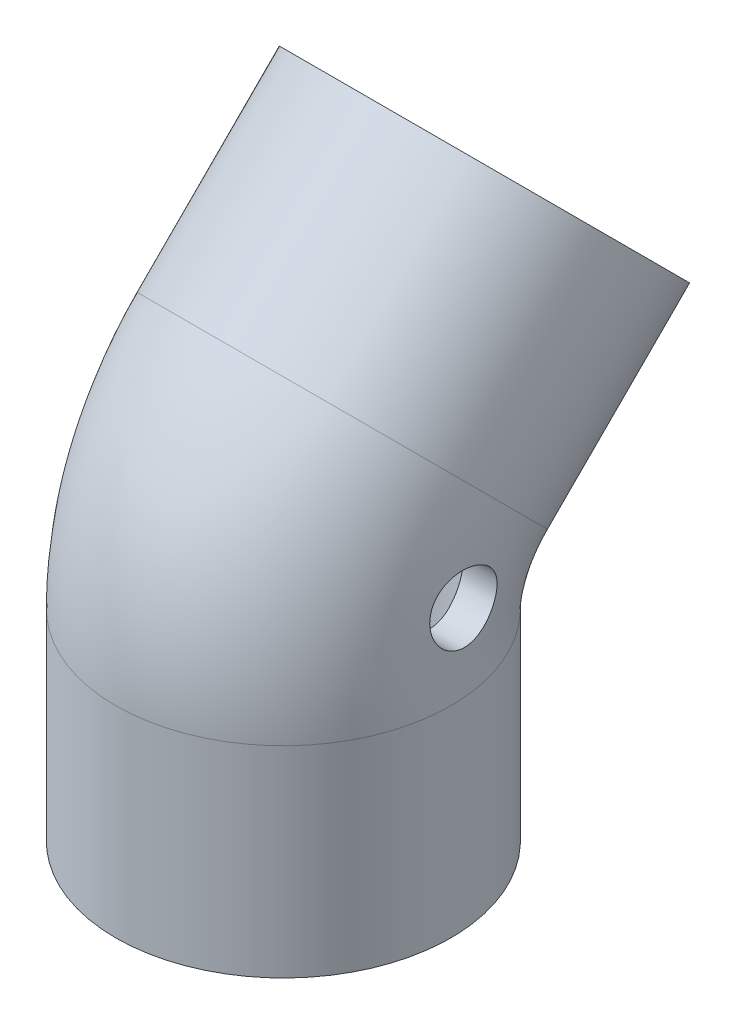
ISO-10303-21;
HEADER;
FILE_DESCRIPTION(('STEP AP214'),'2;1');
FILE_NAME('part.step','',(''),(''),'','','');
FILE_SCHEMA(('AUTOMOTIVE_DESIGN { 1 0 10303 214 1 1 1 1 }'));
ENDSEC;
DATA;
#1=APPLICATION_CONTEXT('core data for automotive mechanical design processes');
#2=APPLICATION_PROTOCOL_DEFINITION('international standard','automotive_design',2000,#1);
#3=PRODUCT_CONTEXT('',#1,'mechanical');
#4=PRODUCT('Part','Part','',(#3));
#5=PRODUCT_RELATED_PRODUCT_CATEGORY('part','',(#4));
#6=PRODUCT_DEFINITION_FORMATION('','',#4);
#7=PRODUCT_DEFINITION_CONTEXT('part definition',#1,'design');
#8=PRODUCT_DEFINITION('design','',#6,#7);
#9=PRODUCT_DEFINITION_SHAPE('','',#8);
#10=(LENGTH_UNIT() NAMED_UNIT(*) SI_UNIT(.MILLI.,.METRE.));
#11=(NAMED_UNIT(*) PLANE_ANGLE_UNIT() SI_UNIT($,.RADIAN.));
#12=(NAMED_UNIT(*) SI_UNIT($,.STERADIAN.) SOLID_ANGLE_UNIT());
#13=UNCERTAINTY_MEASURE_WITH_UNIT(LENGTH_MEASURE(1.E-05),#10,'distance_accuracy_value','');
#14=(GEOMETRIC_REPRESENTATION_CONTEXT(3) GLOBAL_UNCERTAINTY_ASSIGNED_CONTEXT((#13)) GLOBAL_UNIT_ASSIGNED_CONTEXT((#10,
#11,#12)) REPRESENTATION_CONTEXT('',''));
#15=CARTESIAN_POINT('',(0.,0.,0.));
#16=DIRECTION('',(0.,0.,1.));
#17=DIRECTION('',(1.,0.,0.));
#18=AXIS2_PLACEMENT_3D('',#15,#16,#17);
#19=CARTESIAN_POINT('',(0.,15.,-15.));
#20=DIRECTION('',(-1.,0.,0.));
#21=DIRECTION('',(0.,0.,1.));
#22=AXIS2_PLACEMENT_3D('',#19,#20,#21);
#23=TOROIDAL_SURFACE('',#22,15.,12.5);
#24=CARTESIAN_POINT('',(12.288883588417,18.9948372391797,-2.93164753841922));
#25=CARTESIAN_POINT('',(12.3003874428069,18.8937970530453,-2.83310858764716));
#26=CARTESIAN_POINT('',(12.3137714026915,18.8011760237777,-2.72605085239143));
#27=CARTESIAN_POINT('',(12.3423878016527,18.6353105691316,-2.49795967632841));
#28=CARTESIAN_POINT('',(12.357622186022,18.5620867971623,-2.37691153444068));
#29=CARTESIAN_POINT('',(12.3878932182851,18.4370715600438,-2.12425755544));
#30=CARTESIAN_POINT('',(12.4029299667146,18.3852687546265,-1.99265734876563));
#31=CARTESIAN_POINT('',(12.4309589320613,18.3045305064457,-1.72244470115781));
#32=CARTESIAN_POINT('',(12.4439517398107,18.2755884456713,-1.58383430199431));
#33=CARTESIAN_POINT('',(12.4664068014922,18.2415112232606,-1.30362383571792));
#34=CARTESIAN_POINT('',(12.4758740523374,18.2363422481425,-1.16202830284697));
#35=CARTESIAN_POINT('',(12.4903429453535,18.2500117535003,-0.879767456934533));
#36=CARTESIAN_POINT('',(12.4953449442561,18.2688483158676,-0.739102070474471));
#37=CARTESIAN_POINT('',(12.5004533046702,18.3294572130655,-0.465551626485015));
#38=CARTESIAN_POINT('',(12.5006517544592,18.3707825591869,-0.332569073933029));
#39=CARTESIAN_POINT('',(12.4965569986737,18.474874034788,-0.075358659830736));
#40=CARTESIAN_POINT('',(12.4922639032033,18.5376396386636,0.0488694162439837));
#41=CARTESIAN_POINT('',(12.4798336206555,18.6824287292132,0.284518159407894));
#42=CARTESIAN_POINT('',(12.4717143512883,18.7643615657344,0.395995544374081));
#43=CARTESIAN_POINT('',(12.4525790026319,18.9453091017457,0.603806904643763));
#44=CARTESIAN_POINT('',(12.4415627078259,19.0443250719038,0.700139752455366));
#45=CARTESIAN_POINT('',(12.4176153750525,19.258203057357,0.876360157819983));
#46=CARTESIAN_POINT('',(12.4046597216919,19.3732672511891,0.955998979157651));
#47=CARTESIAN_POINT('',(12.3782494341171,19.6150095151522,1.09499292354472));
#48=CARTESIAN_POINT('',(12.3647947598023,19.74168851984,1.15434641256573));
#49=CARTESIAN_POINT('',(12.3385277777851,20.0048008643738,1.25173033832018));
#50=CARTESIAN_POINT('',(12.3257250280151,20.1413324009613,1.28949842604306));
#51=CARTESIAN_POINT('',(12.3021788808415,20.4189841159326,1.34148385925607));
#52=CARTESIAN_POINT('',(12.2914354306454,20.560104176576,1.35570180855137));
#53=CARTESIAN_POINT('',(12.273089930619,20.8422739303841,1.36007382402743));
#54=CARTESIAN_POINT('',(12.2654736154289,20.9833209440594,1.35033861557051));
#55=CARTESIAN_POINT('',(12.2540480333639,21.2619090566992,1.30722055756653));
#56=CARTESIAN_POINT('',(12.2502384207945,21.3994504729087,1.27383985578585));
#57=CARTESIAN_POINT('',(12.246818698117,21.6651912298252,1.18496195942299));
#58=CARTESIAN_POINT('',(12.2471529995867,21.7934910562248,1.12976711487198));
#59=CARTESIAN_POINT('',(12.2518542011023,22.0390680137187,0.998855493655339));
#60=CARTESIAN_POINT('',(12.256220984926,22.1563454623873,0.923139308490056));
#61=CARTESIAN_POINT('',(12.2685488438142,22.3761347375974,0.753730889226753));
#62=CARTESIAN_POINT('',(12.2764956458914,22.4787030867614,0.660110879782226));
#63=CARTESIAN_POINT('',(12.295238749662,22.6668467150864,0.457367821099208));
#64=CARTESIAN_POINT('',(12.3060352266668,22.7524209482045,0.348243818248384));
#65=CARTESIAN_POINT('',(12.3296028174033,22.9051255993151,0.11628864322844));
#66=CARTESIAN_POINT('',(12.3423936749366,22.9720505989556,-0.00667573177779422));
#67=CARTESIAN_POINT('',(12.3686527952611,23.0844693808191,-0.261977167830172));
#68=CARTESIAN_POINT('',(12.382121112902,23.1299614246474,-0.394314988141228));
#69=CARTESIAN_POINT('',(12.4085813179926,23.1986662394157,-0.66631522916604));
#70=CARTESIAN_POINT('',(12.4215660995535,23.2216213723198,-0.806043533289644));
#71=CARTESIAN_POINT('',(12.4455554641779,23.2436463203071,-1.08754399278206));
#72=CARTESIAN_POINT('',(12.4565600787453,23.2427165154268,-1.22931611559552));
#73=CARTESIAN_POINT('',(12.47533302631,23.2169454694891,-1.51034157798607));
#74=CARTESIAN_POINT('',(12.4831137342956,23.192196896462,-1.64960254888811));
#75=CARTESIAN_POINT('',(12.4945385936525,23.1195356699708,-1.92211884591513));
#76=CARTESIAN_POINT('',(12.4981832382143,23.0716257792683,-2.05537488625687));
#77=CARTESIAN_POINT('',(12.5007378993866,22.9549399218379,-2.30990159818192));
#78=CARTESIAN_POINT('',(12.499722060136,22.8865067955249,-2.4313287876631));
#79=CARTESIAN_POINT('',(12.4930445528985,22.7305184208721,-2.66105431135712));
#80=CARTESIAN_POINT('',(12.4873831138783,22.6429641151097,-2.76935329231515));
#81=CARTESIAN_POINT('',(12.4719152962346,22.4519040325848,-2.96916522583562));
#82=CARTESIAN_POINT('',(12.4621347877511,22.3485003341608,-3.06077791980664));
#83=CARTESIAN_POINT('',(12.4393952599865,22.1282705377154,-3.22563246078265));
#84=CARTESIAN_POINT('',(12.426435903191,22.0114430151195,-3.29887235538371));
#85=CARTESIAN_POINT('',(12.3985402022792,21.7656852945775,-3.42608339903032));
#86=CARTESIAN_POINT('',(12.3835769932665,21.6365991611941,-3.47974733414348));
#87=CARTESIAN_POINT('',(12.3536414810486,21.3712909853386,-3.56486326860571));
#88=CARTESIAN_POINT('',(12.3386691770662,21.2350682101623,-3.59631298244746));
#89=CARTESIAN_POINT('',(12.3104783666979,20.9571244370841,-3.63639202664159));
#90=CARTESIAN_POINT('',(12.2972876022002,20.8153529687929,-3.64469293728533));
#91=CARTESIAN_POINT('',(12.2748348621588,20.5321178243436,-3.6371510180576));
#92=CARTESIAN_POINT('',(12.2655728318641,20.3906541439234,-3.62130852466333));
#93=CARTESIAN_POINT('',(12.2525250559725,20.1144503125081,-3.56624297185889));
#94=CARTESIAN_POINT('',(12.2486540936415,19.9796388136348,-3.52739790619639));
#95=CARTESIAN_POINT('',(12.2467300984423,19.7184520735696,-3.42772628286173));
#96=CARTESIAN_POINT('',(12.2486716797378,19.5920691335314,-3.36692012001189));
#97=CARTESIAN_POINT('',(12.2567171054166,19.3852313598203,-3.24514528968024));
#98=CARTESIAN_POINT('',(12.261501020281,19.3018358727252,-3.18900416877197));
#99=CARTESIAN_POINT('',(12.2735021440345,19.1424924425122,-3.06722152329225));
#100=CARTESIAN_POINT('',(12.2807193969112,19.0665446340589,-3.00157982698998));
#101=CARTESIAN_POINT('',(12.288883588417,18.9948372391797,-2.93164753841922));
#102=B_SPLINE_CURVE_WITH_KNOTS('',3,(#24,#25,#26,#27,#28,#29,#30,#31,#32,#33,#34,#35,#36,#37,
#38,#39,#40,#41,#42,#43,#44,#45,#46,#47,#48,#49,#50,#51,#52,#53,#54,#55,#56,#57,#58,#59,#60,#61,
#62,#63,#64,#65,#66,#67,#68,#69,#70,#71,#72,#73,#74,#75,#76,#77,#78,#79,#80,#81,#82,#83,#84,#85,
#86,#87,#88,#89,#90,#91,#92,#93,#94,#95,#96,#97,#98,#99,#100,#101),.UNSPECIFIED.,.T.,.F.,(4,2,2,
2,2,2,2,2,2,2,2,2,2,2,2,2,2,2,2,2,2,2,2,2,2,2,2,2,2,2,2,2,2,2,2,2,2,2,4),(0.,0.424438661985997,
0.849327448837742,1.27399101052955,1.69853159026181,2.12246814055013,2.5463708192616,
2.96214033649529,3.37789966194325,3.79173107412529,4.20559328096438,4.62524136205356,
5.04492323876115,5.4696030149229,5.89427190249438,6.31698141587934,6.73965253865544,
7.15665995675889,7.57365535645638,7.98900277350331,8.40437574861245,8.8241578033298,
9.24397390007543,9.66853524031383,10.0930898253029,10.5159993100233,10.9388583610878,
11.3550136403662,11.7711484099229,12.1847076962593,12.5983109112889,13.0181509937492,
13.4380342651136,13.8638449710833,14.2896497427499,14.7086443294834,15.1272508008479,
15.4284660073661,15.7296866592812),.UNSPECIFIED.);
#103=CARTESIAN_POINT('',(12.288883588417,18.9948372391797,-2.93164753841922));
#104=VERTEX_POINT('',#103);
#105=EDGE_CURVE('E123',#104,#104,#102,.T.);
#106=ORIENTED_EDGE('',*,*,#105,.T.);
#107=EDGE_LOOP('',(#106));
#108=FACE_BOUND('',#107,.T.);
#109=CARTESIAN_POINT('',(0.,25.6066017177982,-4.39339828220179));
#110=DIRECTION('',(0.,0.707106781186547,-0.707106781186548));
#111=DIRECTION('',(0.,0.707106781186548,0.707106781186547));
#112=AXIS2_PLACEMENT_3D('',#109,#110,#111);
#113=CIRCLE('',#112,12.5);
#114=CARTESIAN_POINT('',(0.,34.4454364826301,4.44543648263005));
#115=VERTEX_POINT('',#114);
#116=EDGE_CURVE('E97',#115,#115,#113,.T.);
#117=ORIENTED_EDGE('',*,*,#116,.F.);
#118=EDGE_LOOP('',(#117));
#119=FACE_BOUND('',#118,.T.);
#120=CARTESIAN_POINT('',(0.,14.9999999999999,0.));
#121=DIRECTION('',(0.,1.,0.));
#122=DIRECTION('',(0.,0.,1.));
#123=AXIS2_PLACEMENT_3D('',#120,#121,#122);
#124=CIRCLE('',#123,12.5);
#125=CARTESIAN_POINT('',(0.,14.9999999999999,12.5));
#126=VERTEX_POINT('',#125);
#127=EDGE_CURVE('E98',#126,#126,#124,.T.);
#128=ORIENTED_EDGE('',*,*,#127,.T.);
#129=EDGE_LOOP('',(#128));
#130=FACE_BOUND('',#129,.T.);
#131=CARTESIAN_POINT('',(-12.288883588417,18.9948372391797,-2.93164753841922));
#132=CARTESIAN_POINT('',(-12.2777229133281,19.0929048318468,-3.02727532144304));
#133=CARTESIAN_POINT('',(-12.2683245620019,19.1989891796134,-3.11496517813435));
#134=CARTESIAN_POINT('',(-12.2544288517944,19.4243645811981,-3.27190345704765));
#135=CARTESIAN_POINT('',(-12.2499335244553,19.5436610868698,-3.3411442260148));
#136=CARTESIAN_POINT('',(-12.2465315839008,19.7921139630912,-3.45912145042502));
#137=CARTESIAN_POINT('',(-12.247626252528,19.9212725884354,-3.50785320016975));
#138=CARTESIAN_POINT('',(-12.2552393234137,20.18567816484,-3.58339582572215));
#139=CARTESIAN_POINT('',(-12.2617574978479,20.3209248599341,-3.61020762222448));
#140=CARTESIAN_POINT('',(-12.2792040204306,20.5931571728481,-3.64121955999185));
#141=CARTESIAN_POINT('',(-12.2901153103469,20.7301341020603,-3.64550627054378));
#142=CARTESIAN_POINT('',(-12.3148131454244,21.0027021327031,-3.63173648744673));
#143=CARTESIAN_POINT('',(-12.3286001826137,21.1382929928133,-3.61367616770501));
#144=CARTESIAN_POINT('',(-12.3575998503518,21.4079232530355,-3.55504445630215));
#145=CARTESIAN_POINT('',(-12.3728393226367,21.5418411552377,-3.51392687039393));
#146=CARTESIAN_POINT('',(-12.4025037756119,21.8010322213587,-3.40990013131575));
#147=CARTESIAN_POINT('',(-12.4169287146196,21.9263049429441,-3.34698986410642));
#148=CARTESIAN_POINT('',(-12.4434120450699,22.166143647358,-3.20016053969492));
#149=CARTESIAN_POINT('',(-12.4554418524808,22.2805726473426,-3.11601211527775));
#150=CARTESIAN_POINT('',(-12.4755937622908,22.4937328453322,-2.92936545182744));
#151=CARTESIAN_POINT('',(-12.483716311999,22.592465839374,-2.82686931511387));
#152=CARTESIAN_POINT('',(-12.4951754747925,22.7697436020721,-2.60830947409199));
#153=CARTESIAN_POINT('',(-12.4985897670818,22.8485980508785,-2.49250100617509));
#154=CARTESIAN_POINT('',(-12.5006971719116,22.9858919716538,-2.24932308985991));
#155=CARTESIAN_POINT('',(-12.499390583824,23.0443327378867,-2.12195437504722));
#156=CARTESIAN_POINT('',(-12.4924305028138,23.1385545856441,-1.86094894366677));
#157=CARTESIAN_POINT('',(-12.4868293009963,23.1745988770711,-1.72740565665933));
#158=CARTESIAN_POINT('',(-12.4720713354235,23.2242018639557,-1.45640115021195));
#159=CARTESIAN_POINT('',(-12.4629143942524,23.2377594372465,-1.31893973559173));
#160=CARTESIAN_POINT('',(-12.4419633296713,23.2421370399908,-1.04256047708997));
#161=CARTESIAN_POINT('',(-12.430145206638,23.2327419593284,-0.903641097665344));
#162=CARTESIAN_POINT('',(-12.4051431527752,23.1911029753242,-0.629392997457251));
#163=CARTESIAN_POINT('',(-12.3919590952452,23.1588569507641,-0.494064611230219));
#164=CARTESIAN_POINT('',(-12.3653124908107,23.0717523945763,-0.228622205857845));
#165=CARTESIAN_POINT('',(-12.3518487462248,23.0165595116882,-0.0986178894345666));
#166=CARTESIAN_POINT('',(-12.3261524125063,22.8850411291628,0.150361523297204));
#167=CARTESIAN_POINT('',(-12.3139198427002,22.8087152978606,0.269336446468873));
#168=CARTESIAN_POINT('',(-12.2918499355255,22.6368868914225,0.493028552716742));
#169=CARTESIAN_POINT('',(-12.2820156017211,22.5413605396738,0.597727785258275));
#170=CARTESIAN_POINT('',(-12.2657146684937,22.3338523838324,0.789617783799687));
#171=CARTESIAN_POINT('',(-12.2592477873851,22.2218719571186,0.876810013875114));
#172=CARTESIAN_POINT('',(-12.2503668060673,21.9861549478341,1.03011486167025));
#173=CARTESIAN_POINT('',(-12.2479032111219,21.8625822361423,1.09647659987288));
#174=CARTESIAN_POINT('',(-12.2471095136474,21.6060829326363,1.20763332917245));
#175=CARTESIAN_POINT('',(-12.2487791646069,21.4731568991242,1.25242960626736));
#176=CARTESIAN_POINT('',(-12.2560589788867,21.2029942112081,1.31889478040749));
#177=CARTESIAN_POINT('',(-12.2616344773958,21.0658055480378,1.34076293591191));
#178=CARTESIAN_POINT('',(-12.2761661332374,20.7898813202942,1.36152687356843));
#179=CARTESIAN_POINT('',(-12.2851224098481,20.6511457013099,1.36042184512163));
#180=CARTESIAN_POINT('',(-12.3056505356214,20.3750594433677,1.33528278825487));
#181=CARTESIAN_POINT('',(-12.3172389455758,20.2377235893151,1.31110033669762));
#182=CARTESIAN_POINT('',(-12.3419135107961,19.9690875232846,1.24033569532217));
#183=CARTESIAN_POINT('',(-12.3549997951,19.8377878326752,1.19375157454651));
#184=CARTESIAN_POINT('',(-12.3816106844272,19.5830672535571,1.07871318965757));
#185=CARTESIAN_POINT('',(-12.395138800033,19.4597738469347,1.00997725833835));
#186=CARTESIAN_POINT('',(-12.4211195979993,19.2264044562651,0.852702200488146));
#187=CARTESIAN_POINT('',(-12.433572249276,19.1163288542129,0.764162501839278));
#188=CARTESIAN_POINT('',(-12.4561225707412,18.9122854817826,0.569468963286026));
#189=CARTESIAN_POINT('',(-12.4662151103071,18.8183529198839,0.463277591771645));
#190=CARTESIAN_POINT('',(-12.4828563697692,18.6496586647348,0.236380559473037));
#191=CARTESIAN_POINT('',(-12.4894054336267,18.5748951111401,0.115676308829247));
#192=CARTESIAN_POINT('',(-12.4980419982529,18.4476772334035,-0.13503366429367));
#193=CARTESIAN_POINT('',(-12.5001893173785,18.3949316641494,-0.264889524965462));
#194=CARTESIAN_POINT('',(-12.4997844421931,18.3118557700591,-0.531566143936225));
#195=CARTESIAN_POINT('',(-12.4972327868318,18.2815228751559,-0.668386101736616));
#196=CARTESIAN_POINT('',(-12.4875796544457,18.2443306317252,-0.943326578650891));
#197=CARTESIAN_POINT('',(-12.4805334098919,18.2371926508062,-1.08141152288568));
#198=CARTESIAN_POINT('',(-12.4625573305176,18.2456959893596,-1.35664019761236));
#199=CARTESIAN_POINT('',(-12.4516267374628,18.2613417581234,-1.49378373900867));
#200=CARTESIAN_POINT('',(-12.426890688946,18.3150951286541,-1.76458022050273));
#201=CARTESIAN_POINT('',(-12.4130607012967,18.3533998435464,-1.89819164698624));
#202=CARTESIAN_POINT('',(-12.3841620943039,18.4515002440857,-2.15707067550408));
#203=CARTESIAN_POINT('',(-12.369094135327,18.5112845286371,-2.28234266228015));
#204=CARTESIAN_POINT('',(-12.3423475115794,18.6375927614562,-2.49880804498899));
#205=CARTESIAN_POINT('',(-12.3305643086408,18.7007355180596,-2.59198010392068));
#206=CARTESIAN_POINT('',(-12.3084185178594,18.8390598888312,-2.76910429339723));
#207=CARTESIAN_POINT('',(-12.2980558955824,18.9142412110934,-2.85305664741432));
#208=CARTESIAN_POINT('',(-12.288883588417,18.9948372391797,-2.93164753841922));
#209=B_SPLINE_CURVE_WITH_KNOTS('',3,(#131,#132,#133,#134,#135,#136,#137,#138,#139,#140,#141,
#142,#143,#144,#145,#146,#147,#148,#149,#150,#151,#152,#153,#154,#155,#156,#157,#158,#159,#160,
#161,#162,#163,#164,#165,#166,#167,#168,#169,#170,#171,#172,#173,#174,#175,#176,#177,#178,#179,
#180,#181,#182,#183,#184,#185,#186,#187,#188,#189,#190,#191,#192,#193,#194,#195,#196,#197,#198,
#199,#200,#201,#202,#203,#204,#205,#206,#207,#208),.UNSPECIFIED.,.T.,.F.,(4,2,2,2,2,2,2,2,2,2,2,
2,2,2,2,2,2,2,2,2,2,2,2,2,2,2,2,2,2,2,2,2,2,2,2,2,2,2,4),(0.,0.411889468897534,
0.823949537262058,1.2361040994008,1.64824134909357,2.05879349219067,2.46941593670731,
2.89020334376481,3.31101226460138,3.73657634558113,4.16209169570692,4.58049911472572,
4.99888000115009,5.41224604108632,5.82563270883216,6.24290843414383,6.66022289959981,
7.08384372791817,7.50747120501111,7.93162654173425,8.35574639240875,8.77458159206005,
9.19339181251183,9.60853137775612,10.0236855910463,10.4415280038063,10.8594064398006,
11.2828231062876,11.7062520065854,12.1305930107901,12.5548928172716,12.973387233251,
13.3918336529212,13.8052344708416,14.2187160299645,14.6358485385016,15.0527599644578,
15.3912760749963,15.7297839785847),.UNSPECIFIED.);
#210=CARTESIAN_POINT('',(-12.288883588417,18.9948372391797,-2.93164753841922));
#211=VERTEX_POINT('',#210);
#212=EDGE_CURVE('E102',#211,#211,#209,.T.);
#213=ORIENTED_EDGE('',*,*,#212,.T.);
#214=EDGE_LOOP('',(#213));
#215=FACE_BOUND('',#214,.T.);
#216=ADVANCED_FACE('F38',(#108,#119,#130,#215),#23,.T.);
#217=CARTESIAN_POINT('',(0.,15.,-15.));
#218=DIRECTION('',(-1.,0.,0.));
#219=DIRECTION('',(0.,0.,1.));
#220=AXIS2_PLACEMENT_3D('',#217,#218,#219);
#221=TOROIDAL_SURFACE('',#220,15.,10.);
#222=CARTESIAN_POINT('',(9.72499693254238,19.0673285651124,-2.99958226852333));
#223=CARTESIAN_POINT('',(9.71223497127756,19.1675473944109,-3.08982583141909));
#224=CARTESIAN_POINT('',(9.70184360116631,19.2752726417541,-3.17211283319867));
#225=CARTESIAN_POINT('',(9.68733489044142,19.5029239722273,-3.31834565650668));
#226=CARTESIAN_POINT('',(9.68321755294937,19.6228500614276,-3.38229146890956));
#227=CARTESIAN_POINT('',(9.68189216876927,19.8715581563725,-3.4899419159074));
#228=CARTESIAN_POINT('',(9.68468660235557,20.0003433250573,-3.53363927770821));
#229=CARTESIAN_POINT('',(9.69675629380745,20.2629985792929,-3.59956431097562));
#230=CARTESIAN_POINT('',(9.70603228416443,20.3968692379461,-3.62178955516636));
#231=CARTESIAN_POINT('',(9.72966602218806,20.6657659445238,-3.64433252613683));
#232=CARTESIAN_POINT('',(9.74401613425973,20.8007899605659,-3.64468303036617));
#233=CARTESIAN_POINT('',(9.77583169121665,21.0687840647574,-3.62377038176643));
#234=CARTESIAN_POINT('',(9.79329784971941,21.2017536748238,-3.60250227272523));
#235=CARTESIAN_POINT('',(9.82987710239602,21.4677403031769,-3.53768766042283));
#236=CARTESIAN_POINT('',(9.84902824212689,21.6005414362387,-3.49327433895385));
#237=CARTESIAN_POINT('',(9.88593733070498,21.8570572628791,-3.38284363039));
#238=CARTESIAN_POINT('',(9.90369519328115,21.9807713937647,-3.3168249068059));
#239=CARTESIAN_POINT('',(9.9359786999212,22.2173261101896,-3.16377413115249));
#240=CARTESIAN_POINT('',(9.95045827278084,22.3300004174051,-3.07647458395149));
#241=CARTESIAN_POINT('',(9.97429148835595,22.5391635576219,-2.88368355212896));
#242=CARTESIAN_POINT('',(9.98364610878614,22.6356554753857,-2.77819554247017));
#243=CARTESIAN_POINT('',(9.99617666468471,22.8070160632866,-2.55521117106723));
#244=CARTESIAN_POINT('',(9.99951528165419,22.8824059458106,-2.43812431791256));
#245=CARTESIAN_POINT('',(10.000385918998,23.0127233544668,-2.19305746359418));
#246=CARTESIAN_POINT('',(9.99791840917035,23.0676525357437,-2.06507834457706));
#247=CARTESIAN_POINT('',(9.98775415957109,23.1547865224743,-1.80411030973334));
#248=CARTESIAN_POINT('',(9.98014197308299,23.1873418588805,-1.67123474914512));
#249=CARTESIAN_POINT('',(9.96071658035609,23.2303756128953,-1.40226089545764));
#250=CARTESIAN_POINT('',(9.94890303534863,23.2408522497575,-1.26616234330477));
#251=CARTESIAN_POINT('',(9.92211772298161,23.239587244484,-0.992160662728407));
#252=CARTESIAN_POINT('',(9.90709789112607,23.2274829034056,-0.854264019413271));
#253=CARTESIAN_POINT('',(9.87552901215,23.1807841008016,-0.582507851036325));
#254=CARTESIAN_POINT('',(9.85897974859867,23.1461864520411,-0.448648900916799));
#255=CARTESIAN_POINT('',(9.8255516833631,23.0543955605717,-0.185461088689652));
#256=CARTESIAN_POINT('',(9.80867397970669,22.9967047022652,-0.0563053110420744));
#257=CARTESIAN_POINT('',(9.77661212534282,22.8602862648948,0.190614531451725));
#258=CARTESIAN_POINT('',(9.76142800422331,22.7815583183813,0.308378397269315));
#259=CARTESIAN_POINT('',(9.73422558890379,22.6050899269648,0.529229950435285));
#260=CARTESIAN_POINT('',(9.72220910194142,22.507338683696,0.632309244415688));
#261=CARTESIAN_POINT('',(9.70254936432628,22.2955565034764,0.82061389299722));
#262=CARTESIAN_POINT('',(9.69490549143267,22.1815278857496,0.905841786830768));
#263=CARTESIAN_POINT('',(9.68486560227827,21.9429403308393,1.05429911762017));
#264=CARTESIAN_POINT('',(9.68236687060707,21.8186401064896,1.11793749968731));
#265=CARTESIAN_POINT('',(9.68255499752073,21.5611977553813,1.22365408975135));
#266=CARTESIAN_POINT('',(9.68524141726242,21.428056377811,1.26573412194887));
#267=CARTESIAN_POINT('',(9.69546708208521,21.1585670227282,1.32676717766465));
#268=CARTESIAN_POINT('',(9.70294370516512,21.0222819918991,1.34600962681359));
#269=CARTESIAN_POINT('',(9.72198007339355,20.7486884748774,1.36193208139328));
#270=CARTESIAN_POINT('',(9.73354007266153,20.6113799255093,1.35861068238058));
#271=CARTESIAN_POINT('',(9.75982000192747,20.3378701504954,1.32947247602866));
#272=CARTESIAN_POINT('',(9.77457485146343,20.2016999792111,1.30339656512871));
#273=CARTESIAN_POINT('',(9.80578564779525,19.9356969055993,1.22921885271454));
#274=CARTESIAN_POINT('',(9.82224182122341,19.8058648509682,1.18111411381955));
#275=CARTESIAN_POINT('',(9.85566379162636,19.5533202220845,1.06296646514065));
#276=CARTESIAN_POINT('',(9.8726330856087,19.4308107178639,0.992489943776582));
#277=CARTESIAN_POINT('',(9.90506048785358,19.1992516387031,0.831813789243634));
#278=CARTESIAN_POINT('',(9.92051854053452,19.0902025587822,0.741613431050625));
#279=CARTESIAN_POINT('',(9.94833140494193,18.8884533341285,0.543675332011881));
#280=CARTESIAN_POINT('',(9.96067989392087,18.7957866121436,0.435902581848252));
#281=CARTESIAN_POINT('',(9.98080634570053,18.6298800625326,0.205941069303715));
#282=CARTESIAN_POINT('',(9.98858505124514,18.5566370789564,0.0837546535082046));
#283=CARTESIAN_POINT('',(9.99841980174259,18.4332452424213,-0.168656363497133));
#284=CARTESIAN_POINT('',(10.0005977087506,18.3826247713499,-0.298645663155173));
#285=CARTESIAN_POINT('',(9.99911889752604,18.3036925626205,-0.565185251452688));
#286=CARTESIAN_POINT('',(9.99546301905125,18.2753776150188,-0.701734593047639));
#287=CARTESIAN_POINT('',(9.98260026384442,18.2420990061423,-0.974940274010785));
#288=CARTESIAN_POINT('',(9.97349167310085,18.2367352746823,-1.11155290211063));
#289=CARTESIAN_POINT('',(9.95060077699577,18.2482381307804,-1.38344788180076));
#290=CARTESIAN_POINT('',(9.93681771885111,18.2651083001827,-1.51873001551322));
#291=CARTESIAN_POINT('',(9.90573245585203,18.3208395584181,-1.78632136469645));
#292=CARTESIAN_POINT('',(9.88838218151706,18.360015553307,-1.9185591629355));
#293=CARTESIAN_POINT('',(9.85222424550288,18.4594317946842,-2.17462953006507));
#294=CARTESIAN_POINT('',(9.83341677044126,18.5196693473665,-2.29846317144282));
#295=CARTESIAN_POINT('',(9.79813511338973,18.6538545450524,-2.52484765829298));
#296=CARTESIAN_POINT('',(9.78159680631799,18.7262500716186,-2.62831186134909));
#297=CARTESIAN_POINT('',(9.75101028920672,18.8860085346953,-2.82337500599232));
#298=CARTESIAN_POINT('',(9.73696176175889,18.97336956054,-2.9149754596222));
#299=CARTESIAN_POINT('',(9.72499693254238,19.0673285651124,-2.99958226852333));
#300=B_SPLINE_CURVE_WITH_KNOTS('',3,(#222,#223,#224,#225,#226,#227,#228,#229,#230,#231,#232,
#233,#234,#235,#236,#237,#238,#239,#240,#241,#242,#243,#244,#245,#246,#247,#248,#249,#250,#251,
#252,#253,#254,#255,#256,#257,#258,#259,#260,#261,#262,#263,#264,#265,#266,#267,#268,#269,#270,
#271,#272,#273,#274,#275,#276,#277,#278,#279,#280,#281,#282,#283,#284,#285,#286,#287,#288,#289,
#290,#291,#292,#293,#294,#295,#296,#297,#298,#299),.UNSPECIFIED.,.T.,.F.,(4,2,2,2,2,2,2,2,2,2,2,
2,2,2,2,2,2,2,2,2,2,2,2,2,2,2,2,2,2,2,2,2,2,2,2,2,2,2,4),(0.,0.405959116059861,
0.811918434101595,1.21802345091505,1.62417436975,2.02971669111506,2.43535200675192,
2.8574042705246,3.27948264697796,3.70716800128614,4.13477173532408,4.55062828668283,
4.96645119049779,5.37560103704074,5.78478388209651,6.20059573111694,6.6164665122865,
7.04182748352554,7.46719588492459,7.89280645004838,8.3183564339758,8.73532515180192,
9.15225858119982,9.56384969748589,9.97546643270604,10.3918322861868,10.8082536751385,
11.2332971547618,11.6583562610912,12.0842727952515,12.5101200844484,12.9266202270558,
13.343060420996,13.7522111584966,14.1614278175512,14.5765702139232,14.9916595323474,
15.3723103695228,15.7529126446548),.UNSPECIFIED.);
#301=CARTESIAN_POINT('',(9.72499693254238,19.0673285651124,-2.99958226852333));
#302=VERTEX_POINT('',#301);
#303=EDGE_CURVE('E105',#302,#302,#300,.T.);
#304=ORIENTED_EDGE('',*,*,#303,.T.);
#305=EDGE_LOOP('',(#304));
#306=FACE_BOUND('',#305,.T.);
#307=CARTESIAN_POINT('',(0.,25.6066017177982,-4.39339828220179));
#308=DIRECTION('',(0.,0.707106781186547,-0.707106781186548));
#309=DIRECTION('',(0.,0.707106781186548,0.707106781186547));
#310=AXIS2_PLACEMENT_3D('',#307,#308,#309);
#311=CIRCLE('',#310,10.);
#312=CARTESIAN_POINT('',(0.,32.6776695296637,2.67766952966369));
#313=VERTEX_POINT('',#312);
#314=EDGE_CURVE('E53',#313,#313,#311,.F.);
#315=ORIENTED_EDGE('',*,*,#314,.F.);
#316=EDGE_LOOP('',(#315));
#317=FACE_BOUND('',#316,.T.);
#318=CARTESIAN_POINT('',(0.,14.9999999999999,0.));
#319=DIRECTION('',(0.,1.,0.));
#320=DIRECTION('',(0.,0.,1.));
#321=AXIS2_PLACEMENT_3D('',#318,#319,#320);
#322=CIRCLE('',#321,10.);
#323=CARTESIAN_POINT('',(0.,14.9999999999999,10.));
#324=VERTEX_POINT('',#323);
#325=EDGE_CURVE('E85',#324,#324,#322,.F.);
#326=ORIENTED_EDGE('',*,*,#325,.T.);
#327=EDGE_LOOP('',(#326));
#328=FACE_BOUND('',#327,.T.);
#329=CARTESIAN_POINT('',(-9.73547239559118,18.9902925058347,-2.9272043265368));
#330=CARTESIAN_POINT('',(-9.75010733379803,18.8892035571431,-2.82811661780955));
#331=CARTESIAN_POINT('',(-9.76708940043195,18.796680106646,-2.72055584994709));
#332=CARTESIAN_POINT('',(-9.80329129239447,18.6311839019692,-2.49155907089674));
#333=CARTESIAN_POINT('',(-9.82251326533314,18.5582301360469,-2.37010974554848));
#334=CARTESIAN_POINT('',(-9.8606212362422,18.4338368809938,-2.11667079609229));
#335=CARTESIAN_POINT('',(-9.87950740421801,18.3823861905069,-1.98468670252687));
#336=CARTESIAN_POINT('',(-9.91464123298683,18.3024312707593,-1.71363594820503));
#337=CARTESIAN_POINT('',(-9.93088972831965,18.273919772371,-1.57457154596963));
#338=CARTESIAN_POINT('',(-9.95887685816994,18.2408675583246,-1.29356653972799));
#339=CARTESIAN_POINT('',(-9.97062837052672,18.2362579127795,-1.1516353928031));
#340=CARTESIAN_POINT('',(-9.98849318084475,18.2511820593572,-0.868688122080646));
#341=CARTESIAN_POINT('',(-9.99460730761851,18.2707123014278,-0.727671866803091));
#342=CARTESIAN_POINT('',(-10.0006443693549,18.3325047961074,-0.454988054485238));
#343=CARTESIAN_POINT('',(-10.0007456150302,18.3740753957933,-0.323167259370215));
#344=CARTESIAN_POINT('',(-9.99542901084758,18.4782906560666,-0.0682658388947678));
#345=CARTESIAN_POINT('',(-9.99001134375471,18.5409346187393,0.0548150757524764));
#346=CARTESIAN_POINT('',(-9.97447509557184,18.68493697256,0.287996722986065));
#347=CARTESIAN_POINT('',(-9.96438823410868,18.7661672456303,0.398178850935148));
#348=CARTESIAN_POINT('',(-9.94066542476543,18.9452554404841,0.603634616769043));
#349=CARTESIAN_POINT('',(-9.92702908810358,19.0431151833217,0.698906619683814));
#350=CARTESIAN_POINT('',(-9.89727063969986,19.255079530619,0.87402220212037));
#351=CARTESIAN_POINT('',(-9.88110126896705,19.369488913094,0.953488814859498));
#352=CARTESIAN_POINT('',(-9.84809349684284,19.6098276990059,1.09233901821175));
#353=CARTESIAN_POINT('',(-9.83125501005184,19.7357585756251,1.15172003603171));
#354=CARTESIAN_POINT('',(-9.79820367039471,19.9982711003743,1.24973131743997));
#355=CARTESIAN_POINT('',(-9.78200838233061,20.1350077731846,1.28795319431154));
#356=CARTESIAN_POINT('',(-9.75216950233191,20.4132487190413,1.34075570436499));
#357=CARTESIAN_POINT('',(-9.73852581239983,20.5547528087423,1.35533724564986));
#358=CARTESIAN_POINT('',(-9.71521911338131,20.8375410159596,1.36027068259787));
#359=CARTESIAN_POINT('',(-9.70552934185676,20.978819939229,1.35078872213102));
#360=CARTESIAN_POINT('',(-9.6909634554472,21.2579896201106,1.30806630686979));
#361=CARTESIAN_POINT('',(-9.6860866231408,21.3958808797023,1.27482939428559));
#362=CARTESIAN_POINT('',(-9.68168534499545,21.6612874136229,1.18646283352556));
#363=CARTESIAN_POINT('',(-9.68204939129182,21.7889608864041,1.13181328700371));
#364=CARTESIAN_POINT('',(-9.68782221278202,22.0334214079743,1.00221926028216));
#365=CARTESIAN_POINT('',(-9.69323077029899,22.1502089262664,0.92727565589505));
#366=CARTESIAN_POINT('',(-9.70851754678828,22.368903651302,0.759859921837752));
#367=CARTESIAN_POINT('',(-9.71836664584431,22.4709021706124,0.667504236247126));
#368=CARTESIAN_POINT('',(-9.74159979506293,22.6582257504989,0.467585583236067));
#369=CARTESIAN_POINT('',(-9.75498417425702,22.7435492578309,0.360021200762637));
#370=CARTESIAN_POINT('',(-9.7842988958547,22.8966378873755,0.130717457008088));
#371=CARTESIAN_POINT('',(-9.80026809503519,22.9640852887434,0.00877100944769451));
#372=CARTESIAN_POINT('',(-9.83308364676997,23.0778058015506,-0.244523118365607));
#373=CARTESIAN_POINT('',(-9.84993011073332,23.1240762162589,-0.37587199348601));
#374=CARTESIAN_POINT('',(-9.88319355129983,23.1948542472816,-0.646938512465289));
#375=CARTESIAN_POINT('',(-9.8995973466721,23.2189553179363,-0.786764209721469));
#376=CARTESIAN_POINT('',(-9.92996931546048,23.2431868160915,-1.06874790064543));
#377=CARTESIAN_POINT('',(-9.94393754123706,23.2433177589713,-1.21090584410212));
#378=CARTESIAN_POINT('',(-9.96782965130294,23.2195117277007,-1.49273576235838));
#379=CARTESIAN_POINT('',(-9.97777600666582,23.1957111445744,-1.63241725984095));
#380=CARTESIAN_POINT('',(-9.99251224131255,23.1247771745396,-1.90600425313768));
#381=CARTESIAN_POINT('',(-9.99730308529201,23.0776481552418,-2.03991082504873));
#382=CARTESIAN_POINT('',(-10.0009334382842,22.9628201066791,-2.29473425016431));
#383=CARTESIAN_POINT('',(-9.9999156649288,22.8956524739756,-2.41588873281693));
#384=CARTESIAN_POINT('',(-9.99213631496249,22.7423650467335,-2.6453272735758));
#385=CARTESIAN_POINT('',(-9.98537518121543,22.6562467138409,-2.75361232329532));
#386=CARTESIAN_POINT('',(-9.96673100488797,22.4686016582092,-2.9532674560788));
#387=CARTESIAN_POINT('',(-9.95490054431968,22.3672398703182,-3.04479778502972));
#388=CARTESIAN_POINT('',(-9.92725666846488,22.1513445327268,-3.20996987732091));
#389=CARTESIAN_POINT('',(-9.91144268003865,22.0368090889243,-3.28360906353199));
#390=CARTESIAN_POINT('',(-9.87710725541018,21.7949149840646,-3.41268766384091));
#391=CARTESIAN_POINT('',(-9.85853304160388,21.6673262998731,-3.46768174805489));
#392=CARTESIAN_POINT('',(-9.82114067107079,21.4048290109346,-3.55583130839242));
#393=CARTESIAN_POINT('',(-9.80232246596051,21.2699189369221,-3.58898238336194));
#394=CARTESIAN_POINT('',(-9.76643739679168,20.9929696177277,-3.63304059687845));
#395=CARTESIAN_POINT('',(-9.7494217060604,20.8508374562992,-3.64341008927094));
#396=CARTESIAN_POINT('',(-9.7201643900228,20.5663738303652,-3.63980333600615));
#397=CARTESIAN_POINT('',(-9.70792203745002,20.4240423995396,-3.62583080087891));
#398=CARTESIAN_POINT('',(-9.69037845624624,20.146686368137,-3.57431876750536));
#399=CARTESIAN_POINT('',(-9.68492285174261,20.0115688651781,-3.53733328167379));
#400=CARTESIAN_POINT('',(-9.68133475815252,19.74939107222,-3.441296376473));
#401=CARTESIAN_POINT('',(-9.6831963434962,19.6223243472875,-3.38226284698912));
#402=CARTESIAN_POINT('',(-9.69266237798492,19.4080658237009,-3.26001675873891));
#403=CARTESIAN_POINT('',(-9.6988436505396,19.3184354721745,-3.20090650083525));
#404=CARTESIAN_POINT('',(-9.71472872415243,19.1476758633066,-3.07187323460277));
#405=CARTESIAN_POINT('',(-9.72443278061309,19.0665472228906,-3.00194944250166));
#406=CARTESIAN_POINT('',(-9.73547239559118,18.9902925058347,-2.9272043265368));
#407=B_SPLINE_CURVE_WITH_KNOTS('',3,(#329,#330,#331,#332,#333,#334,#335,#336,#337,#338,#339,
#340,#341,#342,#343,#344,#345,#346,#347,#348,#349,#350,#351,#352,#353,#354,#355,#356,#357,#358,
#359,#360,#361,#362,#363,#364,#365,#366,#367,#368,#369,#370,#371,#372,#373,#374,#375,#376,#377,
#378,#379,#380,#381,#382,#383,#384,#385,#386,#387,#388,#389,#390,#391,#392,#393,#394,#395,#396,
#397,#398,#399,#400,#401,#402,#403,#404,#405,#406),.UNSPECIFIED.,.T.,.F.,(4,2,2,2,2,2,2,2,2,2,2,
2,2,2,2,2,2,2,2,2,2,2,2,2,2,2,2,2,2,2,2,2,2,2,2,2,2,2,4),(0.,0.426525279930137,
0.853462928009015,1.28017789820398,1.70675759473593,2.13210640302066,2.5573926662397,
2.97006065888878,3.38271498600642,3.79260623179625,4.20254239277318,4.62131770788857,
5.04014664424967,5.4668000723089,5.89343711081938,6.3171365052443,6.74077273308136,
7.15540900912418,7.57002739392931,7.98196549942138,8.39394195785782,8.81281255068958,
9.23173646873178,9.65819786438607,10.0846500907385,10.5086855707989,10.9326416918398,
11.346226785677,11.7597799913393,12.169143645956,12.5785662324357,12.9971733243919,
13.4158647358359,13.844335680617,14.2727413179703,14.6912125745633,15.1093450167156,
15.4310637270388,15.7528057666905),.UNSPECIFIED.);
#408=CARTESIAN_POINT('',(-9.73547239559118,18.9902925058347,-2.9272043265368));
#409=VERTEX_POINT('',#408);
#410=EDGE_CURVE('E42',#409,#409,#407,.T.);
#411=ORIENTED_EDGE('',*,*,#410,.T.);
#412=EDGE_LOOP('',(#411));
#413=FACE_BOUND('',#412,.T.);
#414=ADVANCED_FACE('F80',(#306,#317,#328,#413),#221,.F.);
#415=CARTESIAN_POINT('',(0.,0.,0.));
#416=DIRECTION('',(0.,1.,0.));
#417=DIRECTION('',(0.,0.,1.));
#418=AXIS2_PLACEMENT_3D('',#415,#416,#417);
#419=CYLINDRICAL_SURFACE('',#418,12.5);
#420=ORIENTED_EDGE('',*,*,#127,.F.);
#421=EDGE_LOOP('',(#420));
#422=FACE_BOUND('',#421,.T.);
#423=CARTESIAN_POINT('',(0.,0.,0.));
#424=DIRECTION('',(0.,1.,0.));
#425=DIRECTION('',(0.,0.,1.));
#426=AXIS2_PLACEMENT_3D('',#423,#424,#425);
#427=CIRCLE('',#426,12.5);
#428=CARTESIAN_POINT('',(0.,0.,12.5));
#429=VERTEX_POINT('',#428);
#430=EDGE_CURVE('E59',#429,#429,#427,.T.);
#431=ORIENTED_EDGE('',*,*,#430,.T.);
#432=EDGE_LOOP('',(#431));
#433=FACE_BOUND('',#432,.T.);
#434=ADVANCED_FACE('F117',(#422,#433),#419,.T.);
#435=CARTESIAN_POINT('',(0.,25.6066017177982,-4.39339828220179));
#436=DIRECTION('',(0.,0.707106781186547,-0.707106781186548));
#437=DIRECTION('',(0.,0.707106781186548,0.707106781186547));
#438=AXIS2_PLACEMENT_3D('',#435,#436,#437);
#439=CYLINDRICAL_SURFACE('',#438,12.5);
#440=CARTESIAN_POINT('',(0.,36.2132034355964,-15.));
#441=DIRECTION('',(0.,0.707106781186547,-0.707106781186548));
#442=DIRECTION('',(0.,0.707106781186548,0.707106781186547));
#443=AXIS2_PLACEMENT_3D('',#440,#441,#442);
#444=CIRCLE('',#443,12.5);
#445=CARTESIAN_POINT('',(0.,45.0520382004283,-6.16116523516816));
#446=VERTEX_POINT('',#445);
#447=EDGE_CURVE('E64',#446,#446,#444,.T.);
#448=ORIENTED_EDGE('',*,*,#447,.F.);
#449=EDGE_LOOP('',(#448));
#450=FACE_BOUND('',#449,.T.);
#451=ORIENTED_EDGE('',*,*,#116,.T.);
#452=EDGE_LOOP('',(#451));
#453=FACE_BOUND('',#452,.T.);
#454=ADVANCED_FACE('F40',(#450,#453),#439,.T.);
#455=CARTESIAN_POINT('',(0.,0.,0.));
#456=DIRECTION('',(0.,1.,0.));
#457=DIRECTION('',(0.,0.,1.));
#458=AXIS2_PLACEMENT_3D('',#455,#456,#457);
#459=PLANE('',#458);
#460=CARTESIAN_POINT('',(0.,0.,0.));
#461=DIRECTION('',(0.,1.,0.));
#462=DIRECTION('',(0.,0.,1.));
#463=AXIS2_PLACEMENT_3D('',#460,#461,#462);
#464=CIRCLE('',#463,10.);
#465=CARTESIAN_POINT('',(0.,0.,10.));
#466=VERTEX_POINT('',#465);
#467=EDGE_CURVE('E89',#466,#466,#464,.F.);
#468=ORIENTED_EDGE('',*,*,#467,.F.);
#469=EDGE_LOOP('',(#468));
#470=FACE_BOUND('',#469,.T.);
#471=ORIENTED_EDGE('',*,*,#430,.F.);
#472=EDGE_LOOP('',(#471));
#473=FACE_BOUND('',#472,.T.);
#474=ADVANCED_FACE('F140',(#470,#473),#459,.F.);
#475=CARTESIAN_POINT('',(0.,36.2132034355964,-15.));
#476=DIRECTION('',(0.,0.707106781186547,-0.707106781186548));
#477=DIRECTION('',(0.,0.707106781186548,0.707106781186547));
#478=AXIS2_PLACEMENT_3D('',#475,#476,#477);
#479=PLANE('',#478);
#480=CARTESIAN_POINT('',(0.,36.2132034355964,-15.));
#481=DIRECTION('',(0.,0.707106781186547,-0.707106781186548));
#482=DIRECTION('',(0.,0.707106781186548,0.707106781186547));
#483=AXIS2_PLACEMENT_3D('',#480,#481,#482);
#484=CIRCLE('',#483,10.);
#485=CARTESIAN_POINT('',(0.,43.2842712474619,-7.92893218813453));
#486=VERTEX_POINT('',#485);
#487=EDGE_CURVE('E11',#486,#486,#484,.F.);
#488=ORIENTED_EDGE('',*,*,#487,.T.);
#489=EDGE_LOOP('',(#488));
#490=FACE_BOUND('',#489,.T.);
#491=ORIENTED_EDGE('',*,*,#447,.T.);
#492=EDGE_LOOP('',(#491));
#493=FACE_BOUND('',#492,.T.);
#494=ADVANCED_FACE('F71',(#490,#493),#479,.T.);
#495=CARTESIAN_POINT('',(0.,0.,0.));
#496=DIRECTION('',(0.,1.,0.));
#497=DIRECTION('',(0.,0.,1.));
#498=AXIS2_PLACEMENT_3D('',#495,#496,#497);
#499=CYLINDRICAL_SURFACE('',#498,10.);
#500=ORIENTED_EDGE('',*,*,#325,.F.);
#501=EDGE_LOOP('',(#500));
#502=FACE_BOUND('',#501,.T.);
#503=ORIENTED_EDGE('',*,*,#467,.T.);
#504=EDGE_LOOP('',(#503));
#505=FACE_BOUND('',#504,.T.);
#506=ADVANCED_FACE('F78',(#502,#505),#499,.F.);
#507=CARTESIAN_POINT('',(0.,25.6066017177982,-4.39339828220179));
#508=DIRECTION('',(0.,0.707106781186547,-0.707106781186548));
#509=DIRECTION('',(0.,0.707106781186548,0.707106781186547));
#510=AXIS2_PLACEMENT_3D('',#507,#508,#509);
#511=CYLINDRICAL_SURFACE('',#510,10.);
#512=ORIENTED_EDGE('',*,*,#487,.F.);
#513=EDGE_LOOP('',(#512));
#514=FACE_BOUND('',#513,.T.);
#515=ORIENTED_EDGE('',*,*,#314,.T.);
#516=EDGE_LOOP('',(#515));
#517=FACE_BOUND('',#516,.T.);
#518=ADVANCED_FACE('F74',(#514,#517),#511,.F.);
#519=CARTESIAN_POINT('',(20.,20.7402514854761,-1.14180701233058));
#520=DIRECTION('',(-1.,0.,0.));
#521=DIRECTION('',(0.,0.,1.));
#522=AXIS2_PLACEMENT_3D('',#519,#520,#521);
#523=CYLINDRICAL_SURFACE('',#522,2.5);
#524=ORIENTED_EDGE('',*,*,#105,.F.);
#525=EDGE_LOOP('',(#524));
#526=FACE_BOUND('',#525,.T.);
#527=ORIENTED_EDGE('',*,*,#303,.F.);
#528=EDGE_LOOP('',(#527));
#529=FACE_BOUND('',#528,.T.);
#530=ADVANCED_FACE('F77',(#526,#529),#523,.F.);
#531=ORIENTED_EDGE('',*,*,#212,.F.);
#532=EDGE_LOOP('',(#531));
#533=FACE_BOUND('',#532,.T.);
#534=ORIENTED_EDGE('',*,*,#410,.F.);
#535=EDGE_LOOP('',(#534));
#536=FACE_BOUND('',#535,.T.);
#537=ADVANCED_FACE('F115',(#533,#536),#523,.F.);
#538=CLOSED_SHELL('',(#216,#414,#434,#454,#474,#494,#506,#518,#530,#537));
#539=MANIFOLD_SOLID_BREP('B2',#538);
#540=ADVANCED_BREP_SHAPE_REPRESENTATION('',(#18,#539),#14);
#541=SHAPE_DEFINITION_REPRESENTATION(#9,#540);
ENDSEC;
END-ISO-10303-21;
